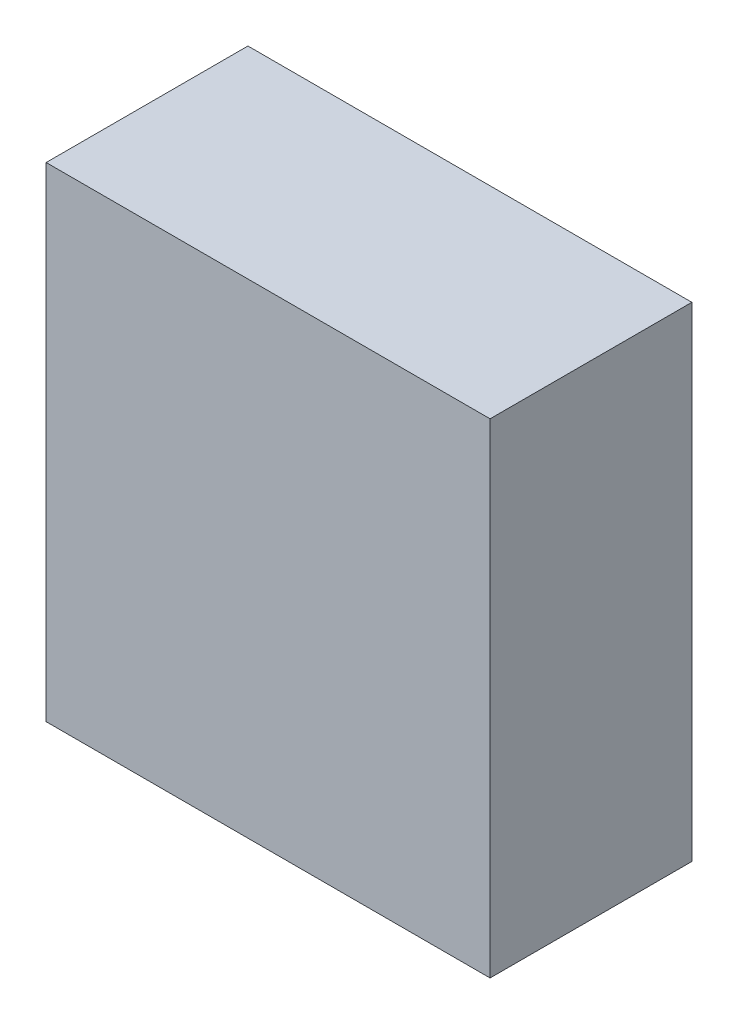
ISO-10303-21;
HEADER;
FILE_DESCRIPTION(('STEP AP214'),'2;1');
FILE_NAME('part.step','',(''),(''),'','','');
FILE_SCHEMA(('AUTOMOTIVE_DESIGN { 1 0 10303 214 1 1 1 1 }'));
ENDSEC;
DATA;
#1=APPLICATION_CONTEXT('core data for automotive mechanical design processes');
#2=APPLICATION_PROTOCOL_DEFINITION('international standard','automotive_design',2000,#1);
#3=PRODUCT_CONTEXT('',#1,'mechanical');
#4=PRODUCT('Part','Part','',(#3));
#5=PRODUCT_RELATED_PRODUCT_CATEGORY('part','',(#4));
#6=PRODUCT_DEFINITION_FORMATION('','',#4);
#7=PRODUCT_DEFINITION_CONTEXT('part definition',#1,'design');
#8=PRODUCT_DEFINITION('design','',#6,#7);
#9=PRODUCT_DEFINITION_SHAPE('','',#8);
#10=(LENGTH_UNIT() NAMED_UNIT(*) SI_UNIT(.MILLI.,.METRE.));
#11=(NAMED_UNIT(*) PLANE_ANGLE_UNIT() SI_UNIT($,.RADIAN.));
#12=(NAMED_UNIT(*) SI_UNIT($,.STERADIAN.) SOLID_ANGLE_UNIT());
#13=UNCERTAINTY_MEASURE_WITH_UNIT(LENGTH_MEASURE(1.E-05),#10,'distance_accuracy_value','');
#14=(GEOMETRIC_REPRESENTATION_CONTEXT(3) GLOBAL_UNCERTAINTY_ASSIGNED_CONTEXT((#13)) GLOBAL_UNIT_ASSIGNED_CONTEXT((#10,
#11,#12)) REPRESENTATION_CONTEXT('',''));
#15=CARTESIAN_POINT('',(0.,0.,0.));
#16=DIRECTION('',(0.,0.,1.));
#17=DIRECTION('',(1.,0.,0.));
#18=AXIS2_PLACEMENT_3D('',#15,#16,#17);
#19=CARTESIAN_POINT('',(-3.3,-3.6,3.));
#20=DIRECTION('',(-1.,0.,0.));
#21=DIRECTION('',(0.,0.,1.));
#22=AXIS2_PLACEMENT_3D('',#19,#20,#21);
#23=PLANE('',#22);
#24=DIRECTION('',(0.,1.,0.));
#25=VECTOR('',#24,1.);
#26=CARTESIAN_POINT('',(-3.3,-3.6,0.));
#27=LINE('',#26,#25);
#28=CARTESIAN_POINT('',(-3.3,-3.6,0.));
#29=VERTEX_POINT('',#28);
#30=CARTESIAN_POINT('',(-3.3,3.6,0.));
#31=VERTEX_POINT('',#30);
#32=EDGE_CURVE('E102',#29,#31,#27,.T.);
#33=ORIENTED_EDGE('',*,*,#32,.F.);
#34=DIRECTION('',(0.,0.,-1.));
#35=VECTOR('',#34,1.);
#36=CARTESIAN_POINT('',(-3.3,-3.6,3.));
#37=LINE('',#36,#35);
#38=CARTESIAN_POINT('',(-3.3,-3.6,3.));
#39=VERTEX_POINT('',#38);
#40=EDGE_CURVE('E11',#39,#29,#37,.T.);
#41=ORIENTED_EDGE('',*,*,#40,.F.);
#42=DIRECTION('',(0.,1.,0.));
#43=VECTOR('',#42,1.);
#44=CARTESIAN_POINT('',(-3.3,-3.6,3.));
#45=LINE('',#44,#43);
#46=CARTESIAN_POINT('',(-3.3,3.6,3.));
#47=VERTEX_POINT('',#46);
#48=EDGE_CURVE('E97',#39,#47,#45,.T.);
#49=ORIENTED_EDGE('',*,*,#48,.T.);
#50=DIRECTION('',(0.,0.,-1.));
#51=VECTOR('',#50,1.);
#52=CARTESIAN_POINT('',(-3.3,3.6,3.));
#53=LINE('',#52,#51);
#54=EDGE_CURVE('E45',#47,#31,#53,.T.);
#55=ORIENTED_EDGE('',*,*,#54,.T.);
#56=EDGE_LOOP('',(#33,#41,#49,#55));
#57=FACE_BOUND('',#56,.T.);
#58=ADVANCED_FACE('F39',(#57),#23,.T.);
#59=CARTESIAN_POINT('',(-3.3,-3.6,3.));
#60=DIRECTION('',(0.,1.,0.));
#61=DIRECTION('',(-1.,0.,0.));
#62=AXIS2_PLACEMENT_3D('',#59,#60,#61);
#63=PLANE('',#62);
#64=DIRECTION('',(1.,0.,0.));
#65=VECTOR('',#64,1.);
#66=CARTESIAN_POINT('',(-3.3,-3.6,0.));
#67=LINE('',#66,#65);
#68=CARTESIAN_POINT('',(3.3,-3.6,0.));
#69=VERTEX_POINT('',#68);
#70=EDGE_CURVE('E75',#29,#69,#67,.T.);
#71=ORIENTED_EDGE('',*,*,#70,.T.);
#72=DIRECTION('',(0.,0.,-1.));
#73=VECTOR('',#72,1.);
#74=CARTESIAN_POINT('',(3.3,-3.6,3.));
#75=LINE('',#74,#73);
#76=CARTESIAN_POINT('',(3.3,-3.6,3.));
#77=VERTEX_POINT('',#76);
#78=EDGE_CURVE('E48',#77,#69,#75,.T.);
#79=ORIENTED_EDGE('',*,*,#78,.F.);
#80=DIRECTION('',(1.,0.,0.));
#81=VECTOR('',#80,1.);
#82=CARTESIAN_POINT('',(-3.3,-3.6,3.));
#83=LINE('',#82,#81);
#84=EDGE_CURVE('E90',#39,#77,#83,.T.);
#85=ORIENTED_EDGE('',*,*,#84,.F.);
#86=ORIENTED_EDGE('',*,*,#40,.T.);
#87=EDGE_LOOP('',(#71,#79,#85,#86));
#88=FACE_BOUND('',#87,.T.);
#89=ADVANCED_FACE('F111',(#88),#63,.F.);
#90=CARTESIAN_POINT('',(3.3,-3.6,3.));
#91=DIRECTION('',(-1.,0.,0.));
#92=DIRECTION('',(0.,0.,1.));
#93=AXIS2_PLACEMENT_3D('',#90,#91,#92);
#94=PLANE('',#93);
#95=DIRECTION('',(0.,1.,0.));
#96=VECTOR('',#95,1.);
#97=CARTESIAN_POINT('',(3.3,-3.6,0.));
#98=LINE('',#97,#96);
#99=CARTESIAN_POINT('',(3.3,3.6,0.));
#100=VERTEX_POINT('',#99);
#101=EDGE_CURVE('E96',#69,#100,#98,.T.);
#102=ORIENTED_EDGE('',*,*,#101,.T.);
#103=DIRECTION('',(0.,0.,-1.));
#104=VECTOR('',#103,1.);
#105=CARTESIAN_POINT('',(3.3,3.6,3.));
#106=LINE('',#105,#104);
#107=CARTESIAN_POINT('',(3.3,3.6,3.));
#108=VERTEX_POINT('',#107);
#109=EDGE_CURVE('E91',#108,#100,#106,.T.);
#110=ORIENTED_EDGE('',*,*,#109,.F.);
#111=DIRECTION('',(0.,1.,0.));
#112=VECTOR('',#111,1.);
#113=CARTESIAN_POINT('',(3.3,-3.6,3.));
#114=LINE('',#113,#112);
#115=EDGE_CURVE('E82',#77,#108,#114,.T.);
#116=ORIENTED_EDGE('',*,*,#115,.F.);
#117=ORIENTED_EDGE('',*,*,#78,.T.);
#118=EDGE_LOOP('',(#102,#110,#116,#117));
#119=FACE_BOUND('',#118,.T.);
#120=ADVANCED_FACE('F94',(#119),#94,.F.);
#121=CARTESIAN_POINT('',(-3.3,3.6,3.));
#122=DIRECTION('',(0.,1.,0.));
#123=DIRECTION('',(-1.,0.,0.));
#124=AXIS2_PLACEMENT_3D('',#121,#122,#123);
#125=PLANE('',#124);
#126=DIRECTION('',(1.,0.,0.));
#127=VECTOR('',#126,1.);
#128=CARTESIAN_POINT('',(-3.3,3.6,0.));
#129=LINE('',#128,#127);
#130=EDGE_CURVE('E110',#31,#100,#129,.T.);
#131=ORIENTED_EDGE('',*,*,#130,.F.);
#132=ORIENTED_EDGE('',*,*,#54,.F.);
#133=DIRECTION('',(1.,0.,0.));
#134=VECTOR('',#133,1.);
#135=CARTESIAN_POINT('',(-3.3,3.6,3.));
#136=LINE('',#135,#134);
#137=EDGE_CURVE('E86',#47,#108,#136,.T.);
#138=ORIENTED_EDGE('',*,*,#137,.T.);
#139=ORIENTED_EDGE('',*,*,#109,.T.);
#140=EDGE_LOOP('',(#131,#132,#138,#139));
#141=FACE_BOUND('',#140,.T.);
#142=ADVANCED_FACE('F98',(#141),#125,.T.);
#143=CARTESIAN_POINT('',(0.,0.,3.));
#144=DIRECTION('',(0.,0.,-1.));
#145=DIRECTION('',(-1.,0.,0.));
#146=AXIS2_PLACEMENT_3D('',#143,#144,#145);
#147=PLANE('',#146);
#148=ORIENTED_EDGE('',*,*,#48,.F.);
#149=ORIENTED_EDGE('',*,*,#84,.T.);
#150=ORIENTED_EDGE('',*,*,#115,.T.);
#151=ORIENTED_EDGE('',*,*,#137,.F.);
#152=EDGE_LOOP('',(#148,#149,#150,#151));
#153=FACE_BOUND('',#152,.T.);
#154=ADVANCED_FACE('F87',(#153),#147,.F.);
#155=CARTESIAN_POINT('',(0.,0.,0.));
#156=DIRECTION('',(0.,0.,-1.));
#157=DIRECTION('',(-1.,0.,0.));
#158=AXIS2_PLACEMENT_3D('',#155,#156,#157);
#159=PLANE('',#158);
#160=ORIENTED_EDGE('',*,*,#32,.T.);
#161=ORIENTED_EDGE('',*,*,#130,.T.);
#162=ORIENTED_EDGE('',*,*,#101,.F.);
#163=ORIENTED_EDGE('',*,*,#70,.F.);
#164=EDGE_LOOP('',(#160,#161,#162,#163));
#165=FACE_BOUND('',#164,.T.);
#166=ADVANCED_FACE('F115',(#165),#159,.T.);
#167=CLOSED_SHELL('',(#58,#89,#120,#142,#154,#166));
#168=MANIFOLD_SOLID_BREP('B2',#167);
#169=ADVANCED_BREP_SHAPE_REPRESENTATION('',(#18,#168),#14);
#170=SHAPE_DEFINITION_REPRESENTATION(#9,#169);
ENDSEC;
END-ISO-10303-21;
